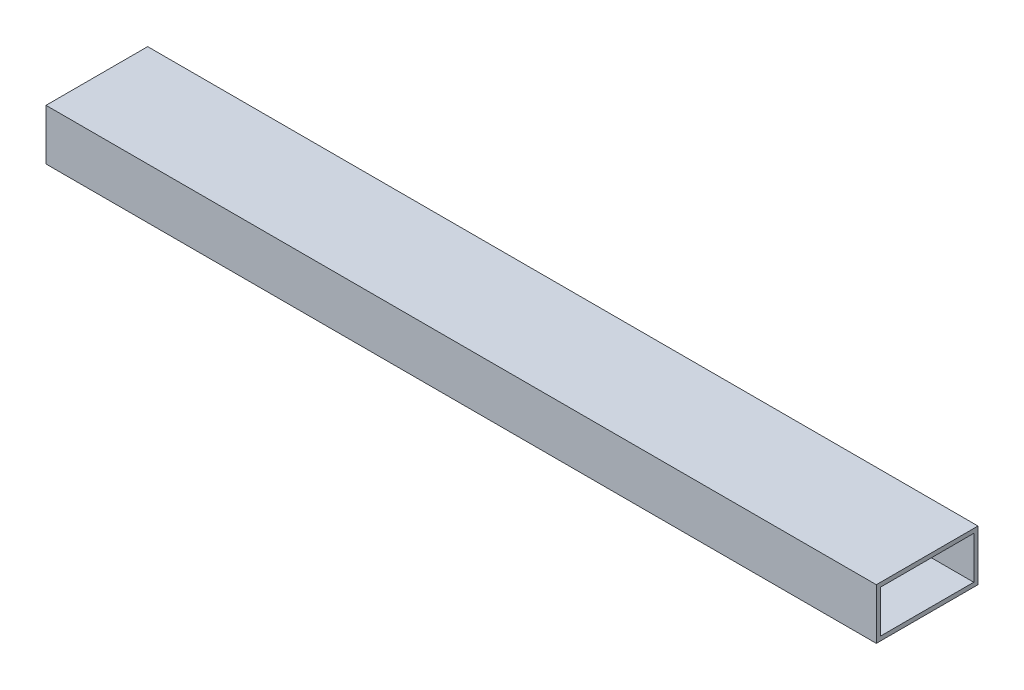
ISO-10303-21;
HEADER;
FILE_DESCRIPTION(('STEP AP214'),'2;1');
FILE_NAME('part.step','',(''),(''),'','','');
FILE_SCHEMA(('AUTOMOTIVE_DESIGN { 1 0 10303 214 1 1 1 1 }'));
ENDSEC;
DATA;
#1=APPLICATION_CONTEXT('core data for automotive mechanical design processes');
#2=APPLICATION_PROTOCOL_DEFINITION('international standard','automotive_design',2000,#1);
#3=PRODUCT_CONTEXT('',#1,'mechanical');
#4=PRODUCT('Part','Part','',(#3));
#5=PRODUCT_RELATED_PRODUCT_CATEGORY('part','',(#4));
#6=PRODUCT_DEFINITION_FORMATION('','',#4);
#7=PRODUCT_DEFINITION_CONTEXT('part definition',#1,'design');
#8=PRODUCT_DEFINITION('design','',#6,#7);
#9=PRODUCT_DEFINITION_SHAPE('','',#8);
#10=(LENGTH_UNIT() NAMED_UNIT(*) SI_UNIT(.MILLI.,.METRE.));
#11=(NAMED_UNIT(*) PLANE_ANGLE_UNIT() SI_UNIT($,.RADIAN.));
#12=(NAMED_UNIT(*) SI_UNIT($,.STERADIAN.) SOLID_ANGLE_UNIT());
#13=UNCERTAINTY_MEASURE_WITH_UNIT(LENGTH_MEASURE(1.E-05),#10,'distance_accuracy_value','');
#14=(GEOMETRIC_REPRESENTATION_CONTEXT(3) GLOBAL_UNCERTAINTY_ASSIGNED_CONTEXT((#13)) GLOBAL_UNIT_ASSIGNED_CONTEXT((#10,
#11,#12)) REPRESENTATION_CONTEXT('',''));
#15=CARTESIAN_POINT('',(0.,0.,0.));
#16=DIRECTION('',(0.,0.,1.));
#17=DIRECTION('',(1.,0.,0.));
#18=AXIS2_PLACEMENT_3D('',#15,#16,#17);
#19=CARTESIAN_POINT('',(311.15,0.,0.));
#20=DIRECTION('',(1.,0.,0.));
#21=DIRECTION('',(0.,0.,-1.));
#22=AXIS2_PLACEMENT_3D('',#19,#20,#21);
#23=PLANE('',#22);
#24=DIRECTION('',(0.,1.,0.));
#25=VECTOR('',#24,1.);
#26=CARTESIAN_POINT('',(311.15,0.,-76.2));
#27=LINE('',#26,#25);
#28=CARTESIAN_POINT('',(311.15,0.,-76.2));
#29=VERTEX_POINT('',#28);
#30=CARTESIAN_POINT('',(311.15,38.1,-76.2));
#31=VERTEX_POINT('',#30);
#32=EDGE_CURVE('E140',#29,#31,#27,.T.);
#33=ORIENTED_EDGE('',*,*,#32,.T.);
#34=DIRECTION('',(0.,0.,1.));
#35=VECTOR('',#34,1.);
#36=CARTESIAN_POINT('',(311.15,38.1,-76.2));
#37=LINE('',#36,#35);
#38=CARTESIAN_POINT('',(311.15,38.1,0.));
#39=VERTEX_POINT('',#38);
#40=EDGE_CURVE('E143',#31,#39,#37,.T.);
#41=ORIENTED_EDGE('',*,*,#40,.T.);
#42=DIRECTION('',(0.,-1.,0.));
#43=VECTOR('',#42,1.);
#44=CARTESIAN_POINT('',(311.15,0.,0.));
#45=LINE('',#44,#43);
#46=CARTESIAN_POINT('',(311.15,0.,0.));
#47=VERTEX_POINT('',#46);
#48=EDGE_CURVE('E146',#39,#47,#45,.T.);
#49=ORIENTED_EDGE('',*,*,#48,.T.);
#50=DIRECTION('',(0.,0.,-1.));
#51=VECTOR('',#50,1.);
#52=CARTESIAN_POINT('',(311.15,0.,-76.2));
#53=LINE('',#52,#51);
#54=EDGE_CURVE('E148',#47,#29,#53,.T.);
#55=ORIENTED_EDGE('',*,*,#54,.T.);
#56=EDGE_LOOP('',(#33,#41,#49,#55));
#57=FACE_BOUND('',#56,.T.);
#58=DIRECTION('',(0.,0.,1.));
#59=VECTOR('',#58,1.);
#60=CARTESIAN_POINT('',(311.15,34.925,-73.025));
#61=LINE('',#60,#59);
#62=CARTESIAN_POINT('',(311.15,34.925,-73.025));
#63=VERTEX_POINT('',#62);
#64=CARTESIAN_POINT('',(311.15,34.925,-3.175));
#65=VERTEX_POINT('',#64);
#66=EDGE_CURVE('E110',#63,#65,#61,.T.);
#67=ORIENTED_EDGE('',*,*,#66,.F.);
#68=DIRECTION('',(0.,1.,0.));
#69=VECTOR('',#68,1.);
#70=CARTESIAN_POINT('',(311.15,3.175,-73.025));
#71=LINE('',#70,#69);
#72=CARTESIAN_POINT('',(311.15,3.175,-73.025));
#73=VERTEX_POINT('',#72);
#74=EDGE_CURVE('E102',#73,#63,#71,.T.);
#75=ORIENTED_EDGE('',*,*,#74,.F.);
#76=DIRECTION('',(0.,0.,-1.));
#77=VECTOR('',#76,1.);
#78=CARTESIAN_POINT('',(311.15,3.175,-73.025));
#79=LINE('',#78,#77);
#80=CARTESIAN_POINT('',(311.15,3.175,-3.175));
#81=VERTEX_POINT('',#80);
#82=EDGE_CURVE('E124',#81,#73,#79,.T.);
#83=ORIENTED_EDGE('',*,*,#82,.F.);
#84=DIRECTION('',(0.,-1.,0.));
#85=VECTOR('',#84,1.);
#86=CARTESIAN_POINT('',(311.15,3.175,-3.175));
#87=LINE('',#86,#85);
#88=EDGE_CURVE('E122',#65,#81,#87,.T.);
#89=ORIENTED_EDGE('',*,*,#88,.F.);
#90=EDGE_LOOP('',(#67,#75,#83,#89));
#91=FACE_BOUND('',#90,.T.);
#92=ADVANCED_FACE('F37',(#57,#91),#23,.T.);
#93=CARTESIAN_POINT('',(-311.15,0.,0.));
#94=DIRECTION('',(1.,0.,0.));
#95=DIRECTION('',(0.,0.,-1.));
#96=AXIS2_PLACEMENT_3D('',#93,#94,#95);
#97=PLANE('',#96);
#98=DIRECTION('',(0.,1.,0.));
#99=VECTOR('',#98,1.);
#100=CARTESIAN_POINT('',(-311.15,0.,-76.2));
#101=LINE('',#100,#99);
#102=CARTESIAN_POINT('',(-311.15,0.,-76.2));
#103=VERTEX_POINT('',#102);
#104=CARTESIAN_POINT('',(-311.15,38.1,-76.2));
#105=VERTEX_POINT('',#104);
#106=EDGE_CURVE('E118',#103,#105,#101,.T.);
#107=ORIENTED_EDGE('',*,*,#106,.F.);
#108=DIRECTION('',(0.,0.,-1.));
#109=VECTOR('',#108,1.);
#110=CARTESIAN_POINT('',(-311.15,0.,-76.2));
#111=LINE('',#110,#109);
#112=CARTESIAN_POINT('',(-311.15,0.,0.));
#113=VERTEX_POINT('',#112);
#114=EDGE_CURVE('E144',#113,#103,#111,.T.);
#115=ORIENTED_EDGE('',*,*,#114,.F.);
#116=DIRECTION('',(0.,-1.,0.));
#117=VECTOR('',#116,1.);
#118=CARTESIAN_POINT('',(-311.15,0.,0.));
#119=LINE('',#118,#117);
#120=CARTESIAN_POINT('',(-311.15,38.1,0.));
#121=VERTEX_POINT('',#120);
#122=EDGE_CURVE('E155',#121,#113,#119,.T.);
#123=ORIENTED_EDGE('',*,*,#122,.F.);
#124=DIRECTION('',(0.,0.,1.));
#125=VECTOR('',#124,1.);
#126=CARTESIAN_POINT('',(-311.15,38.1,-76.2));
#127=LINE('',#126,#125);
#128=EDGE_CURVE('E153',#105,#121,#127,.T.);
#129=ORIENTED_EDGE('',*,*,#128,.F.);
#130=EDGE_LOOP('',(#107,#115,#123,#129));
#131=FACE_BOUND('',#130,.T.);
#132=DIRECTION('',(0.,1.,0.));
#133=VECTOR('',#132,1.);
#134=CARTESIAN_POINT('',(-311.15,3.175,-73.025));
#135=LINE('',#134,#133);
#136=CARTESIAN_POINT('',(-311.15,3.175,-73.025));
#137=VERTEX_POINT('',#136);
#138=CARTESIAN_POINT('',(-311.15,34.925,-73.025));
#139=VERTEX_POINT('',#138);
#140=EDGE_CURVE('E60',#137,#139,#135,.T.);
#141=ORIENTED_EDGE('',*,*,#140,.T.);
#142=DIRECTION('',(0.,0.,1.));
#143=VECTOR('',#142,1.);
#144=CARTESIAN_POINT('',(-311.15,34.925,-73.025));
#145=LINE('',#144,#143);
#146=CARTESIAN_POINT('',(-311.15,34.925,-3.175));
#147=VERTEX_POINT('',#146);
#148=EDGE_CURVE('E117',#139,#147,#145,.T.);
#149=ORIENTED_EDGE('',*,*,#148,.T.);
#150=DIRECTION('',(0.,-1.,0.));
#151=VECTOR('',#150,1.);
#152=CARTESIAN_POINT('',(-311.15,3.175,-3.175));
#153=LINE('',#152,#151);
#154=CARTESIAN_POINT('',(-311.15,3.175,-3.175));
#155=VERTEX_POINT('',#154);
#156=EDGE_CURVE('E132',#147,#155,#153,.T.);
#157=ORIENTED_EDGE('',*,*,#156,.T.);
#158=DIRECTION('',(0.,0.,-1.));
#159=VECTOR('',#158,1.);
#160=CARTESIAN_POINT('',(-311.15,3.175,-73.025));
#161=LINE('',#160,#159);
#162=EDGE_CURVE('E111',#155,#137,#161,.T.);
#163=ORIENTED_EDGE('',*,*,#162,.T.);
#164=EDGE_LOOP('',(#141,#149,#157,#163));
#165=FACE_BOUND('',#164,.T.);
#166=ADVANCED_FACE('F173',(#131,#165),#97,.F.);
#167=CARTESIAN_POINT('',(311.15,0.,-76.2));
#168=DIRECTION('',(0.,0.,1.));
#169=DIRECTION('',(0.,-1.,0.));
#170=AXIS2_PLACEMENT_3D('',#167,#168,#169);
#171=PLANE('',#170);
#172=CARTESIAN_POINT('',(-260.35,19.05,-76.2));
#173=DIRECTION('',(0.,0.,-1.));
#174=DIRECTION('',(0.,1.,0.));
#175=AXIS2_PLACEMENT_3D('',#172,#173,#174);
#176=CIRCLE('',#175,2.55269999999996);
#177=CARTESIAN_POINT('',(-260.35,21.6027,-76.2));
#178=VERTEX_POINT('',#177);
#179=EDGE_CURVE('E221',#178,#178,#176,.T.);
#180=ORIENTED_EDGE('',*,*,#179,.F.);
#181=EDGE_LOOP('',(#180));
#182=FACE_BOUND('',#181,.T.);
#183=CARTESIAN_POINT('',(260.35,19.05,-76.2));
#184=DIRECTION('',(0.,0.,-1.));
#185=DIRECTION('',(0.,1.,0.));
#186=AXIS2_PLACEMENT_3D('',#183,#184,#185);
#187=CIRCLE('',#186,2.55269999999996);
#188=CARTESIAN_POINT('',(260.35,21.6027,-76.2));
#189=VERTEX_POINT('',#188);
#190=EDGE_CURVE('E216',#189,#189,#187,.T.);
#191=ORIENTED_EDGE('',*,*,#190,.F.);
#192=EDGE_LOOP('',(#191));
#193=FACE_BOUND('',#192,.T.);
#194=ORIENTED_EDGE('',*,*,#106,.T.);
#195=DIRECTION('',(-1.,0.,0.));
#196=VECTOR('',#195,1.);
#197=CARTESIAN_POINT('',(311.15,38.1,-76.2));
#198=LINE('',#197,#196);
#199=EDGE_CURVE('E11',#31,#105,#198,.T.);
#200=ORIENTED_EDGE('',*,*,#199,.F.);
#201=ORIENTED_EDGE('',*,*,#32,.F.);
#202=DIRECTION('',(-1.,0.,0.));
#203=VECTOR('',#202,1.);
#204=CARTESIAN_POINT('',(311.15,0.,-76.2));
#205=LINE('',#204,#203);
#206=EDGE_CURVE('E150',#29,#103,#205,.T.);
#207=ORIENTED_EDGE('',*,*,#206,.T.);
#208=EDGE_LOOP('',(#194,#200,#201,#207));
#209=FACE_BOUND('',#208,.T.);
#210=ADVANCED_FACE('F39',(#182,#193,#209),#171,.F.);
#211=CARTESIAN_POINT('',(311.15,38.1,-76.2));
#212=DIRECTION('',(0.,-1.,0.));
#213=DIRECTION('',(0.,0.,-1.));
#214=AXIS2_PLACEMENT_3D('',#211,#212,#213);
#215=PLANE('',#214);
#216=ORIENTED_EDGE('',*,*,#128,.T.);
#217=DIRECTION('',(-1.,0.,0.));
#218=VECTOR('',#217,1.);
#219=CARTESIAN_POINT('',(311.15,38.1,0.));
#220=LINE('',#219,#218);
#221=EDGE_CURVE('E45',#39,#121,#220,.T.);
#222=ORIENTED_EDGE('',*,*,#221,.F.);
#223=ORIENTED_EDGE('',*,*,#40,.F.);
#224=ORIENTED_EDGE('',*,*,#199,.T.);
#225=EDGE_LOOP('',(#216,#222,#223,#224));
#226=FACE_BOUND('',#225,.T.);
#227=ADVANCED_FACE('F183',(#226),#215,.F.);
#228=CARTESIAN_POINT('',(311.15,0.,0.));
#229=DIRECTION('',(0.,0.,-1.));
#230=DIRECTION('',(0.,1.,0.));
#231=AXIS2_PLACEMENT_3D('',#228,#229,#230);
#232=PLANE('',#231);
#233=ORIENTED_EDGE('',*,*,#122,.T.);
#234=DIRECTION('',(-1.,0.,0.));
#235=VECTOR('',#234,1.);
#236=CARTESIAN_POINT('',(311.15,0.,0.));
#237=LINE('',#236,#235);
#238=EDGE_CURVE('E160',#47,#113,#237,.T.);
#239=ORIENTED_EDGE('',*,*,#238,.F.);
#240=ORIENTED_EDGE('',*,*,#48,.F.);
#241=ORIENTED_EDGE('',*,*,#221,.T.);
#242=EDGE_LOOP('',(#233,#239,#240,#241));
#243=FACE_BOUND('',#242,.T.);
#244=ADVANCED_FACE('F167',(#243),#232,.F.);
#245=CARTESIAN_POINT('',(311.15,0.,-76.2));
#246=DIRECTION('',(0.,1.,0.));
#247=DIRECTION('',(0.,0.,1.));
#248=AXIS2_PLACEMENT_3D('',#245,#246,#247);
#249=PLANE('',#248);
#250=ORIENTED_EDGE('',*,*,#114,.T.);
#251=ORIENTED_EDGE('',*,*,#206,.F.);
#252=ORIENTED_EDGE('',*,*,#54,.F.);
#253=ORIENTED_EDGE('',*,*,#238,.T.);
#254=EDGE_LOOP('',(#250,#251,#252,#253));
#255=FACE_BOUND('',#254,.T.);
#256=ADVANCED_FACE('F177',(#255),#249,.F.);
#257=CARTESIAN_POINT('',(311.15,3.175,-73.025));
#258=DIRECTION('',(0.,0.,1.));
#259=DIRECTION('',(1.,0.,0.));
#260=AXIS2_PLACEMENT_3D('',#257,#258,#259);
#261=PLANE('',#260);
#262=CARTESIAN_POINT('',(-260.35,19.05,-73.025));
#263=DIRECTION('',(0.,0.,1.));
#264=DIRECTION('',(1.,0.,0.));
#265=AXIS2_PLACEMENT_3D('',#262,#263,#264);
#266=CIRCLE('',#265,2.55269999999999);
#267=CARTESIAN_POINT('',(-257.7973,19.05,-73.025));
#268=VERTEX_POINT('',#267);
#269=EDGE_CURVE('E212',#268,#268,#266,.T.);
#270=ORIENTED_EDGE('',*,*,#269,.F.);
#271=EDGE_LOOP('',(#270));
#272=FACE_BOUND('',#271,.T.);
#273=CARTESIAN_POINT('',(260.35,19.05,-73.025));
#274=DIRECTION('',(0.,0.,1.));
#275=DIRECTION('',(1.,0.,0.));
#276=AXIS2_PLACEMENT_3D('',#273,#274,#275);
#277=CIRCLE('',#276,2.55269999999999);
#278=CARTESIAN_POINT('',(262.9027,19.05,-73.025));
#279=VERTEX_POINT('',#278);
#280=EDGE_CURVE('E130',#279,#279,#277,.T.);
#281=ORIENTED_EDGE('',*,*,#280,.F.);
#282=EDGE_LOOP('',(#281));
#283=FACE_BOUND('',#282,.T.);
#284=ORIENTED_EDGE('',*,*,#140,.F.);
#285=DIRECTION('',(-1.,0.,0.));
#286=VECTOR('',#285,1.);
#287=CARTESIAN_POINT('',(311.15,3.175,-73.025));
#288=LINE('',#287,#286);
#289=EDGE_CURVE('E106',#73,#137,#288,.T.);
#290=ORIENTED_EDGE('',*,*,#289,.F.);
#291=ORIENTED_EDGE('',*,*,#74,.T.);
#292=DIRECTION('',(-1.,0.,0.));
#293=VECTOR('',#292,1.);
#294=CARTESIAN_POINT('',(311.15,34.925,-73.025));
#295=LINE('',#294,#293);
#296=EDGE_CURVE('E105',#63,#139,#295,.T.);
#297=ORIENTED_EDGE('',*,*,#296,.T.);
#298=EDGE_LOOP('',(#284,#290,#291,#297));
#299=FACE_BOUND('',#298,.T.);
#300=ADVANCED_FACE('F104',(#272,#283,#299),#261,.T.);
#301=CARTESIAN_POINT('',(311.15,34.925,-73.025));
#302=DIRECTION('',(0.,-1.,0.));
#303=DIRECTION('',(0.,0.,-1.));
#304=AXIS2_PLACEMENT_3D('',#301,#302,#303);
#305=PLANE('',#304);
#306=ORIENTED_EDGE('',*,*,#148,.F.);
#307=ORIENTED_EDGE('',*,*,#296,.F.);
#308=ORIENTED_EDGE('',*,*,#66,.T.);
#309=DIRECTION('',(-1.,0.,0.));
#310=VECTOR('',#309,1.);
#311=CARTESIAN_POINT('',(311.15,34.925,-3.175));
#312=LINE('',#311,#310);
#313=EDGE_CURVE('E119',#65,#147,#312,.T.);
#314=ORIENTED_EDGE('',*,*,#313,.T.);
#315=EDGE_LOOP('',(#306,#307,#308,#314));
#316=FACE_BOUND('',#315,.T.);
#317=ADVANCED_FACE('F114',(#316),#305,.T.);
#318=CARTESIAN_POINT('',(311.15,3.175,-3.175));
#319=DIRECTION('',(0.,0.,-1.));
#320=DIRECTION('',(-1.,0.,0.));
#321=AXIS2_PLACEMENT_3D('',#318,#319,#320);
#322=PLANE('',#321);
#323=ORIENTED_EDGE('',*,*,#156,.F.);
#324=ORIENTED_EDGE('',*,*,#313,.F.);
#325=ORIENTED_EDGE('',*,*,#88,.T.);
#326=DIRECTION('',(-1.,0.,0.));
#327=VECTOR('',#326,1.);
#328=CARTESIAN_POINT('',(311.15,3.175,-3.175));
#329=LINE('',#328,#327);
#330=EDGE_CURVE('E52',#81,#155,#329,.T.);
#331=ORIENTED_EDGE('',*,*,#330,.T.);
#332=EDGE_LOOP('',(#323,#324,#325,#331));
#333=FACE_BOUND('',#332,.T.);
#334=ADVANCED_FACE('F208',(#333),#322,.T.);
#335=CARTESIAN_POINT('',(311.15,3.175,-73.025));
#336=DIRECTION('',(0.,1.,0.));
#337=DIRECTION('',(0.,0.,1.));
#338=AXIS2_PLACEMENT_3D('',#335,#336,#337);
#339=PLANE('',#338);
#340=ORIENTED_EDGE('',*,*,#162,.F.);
#341=ORIENTED_EDGE('',*,*,#330,.F.);
#342=ORIENTED_EDGE('',*,*,#82,.T.);
#343=ORIENTED_EDGE('',*,*,#289,.T.);
#344=EDGE_LOOP('',(#340,#341,#342,#343));
#345=FACE_BOUND('',#344,.T.);
#346=ADVANCED_FACE('F232',(#345),#339,.T.);
#347=CARTESIAN_POINT('',(260.35,19.05,-76.2));
#348=DIRECTION('',(0.,0.,-1.));
#349=DIRECTION('',(0.,1.,0.));
#350=AXIS2_PLACEMENT_3D('',#347,#348,#349);
#351=CYLINDRICAL_SURFACE('',#350,2.55269999999999);
#352=ORIENTED_EDGE('',*,*,#190,.T.);
#353=EDGE_LOOP('',(#352));
#354=FACE_BOUND('',#353,.T.);
#355=ORIENTED_EDGE('',*,*,#280,.T.);
#356=EDGE_LOOP('',(#355));
#357=FACE_BOUND('',#356,.T.);
#358=ADVANCED_FACE('F230',(#354,#357),#351,.F.);
#359=CARTESIAN_POINT('',(-260.35,19.05,-76.2));
#360=DIRECTION('',(0.,0.,-1.));
#361=DIRECTION('',(0.,1.,0.));
#362=AXIS2_PLACEMENT_3D('',#359,#360,#361);
#363=CYLINDRICAL_SURFACE('',#362,2.55269999999999);
#364=ORIENTED_EDGE('',*,*,#179,.T.);
#365=EDGE_LOOP('',(#364));
#366=FACE_BOUND('',#365,.T.);
#367=ORIENTED_EDGE('',*,*,#269,.T.);
#368=EDGE_LOOP('',(#367));
#369=FACE_BOUND('',#368,.T.);
#370=ADVANCED_FACE('F225',(#366,#369),#363,.F.);
#371=CLOSED_SHELL('',(#92,#166,#210,#227,#244,#256,#300,#317,#334,#346,#358,#370));
#372=MANIFOLD_SOLID_BREP('B2',#371);
#373=ADVANCED_BREP_SHAPE_REPRESENTATION('',(#18,#372),#14);
#374=SHAPE_DEFINITION_REPRESENTATION(#9,#373);
ENDSEC;
END-ISO-10303-21;
